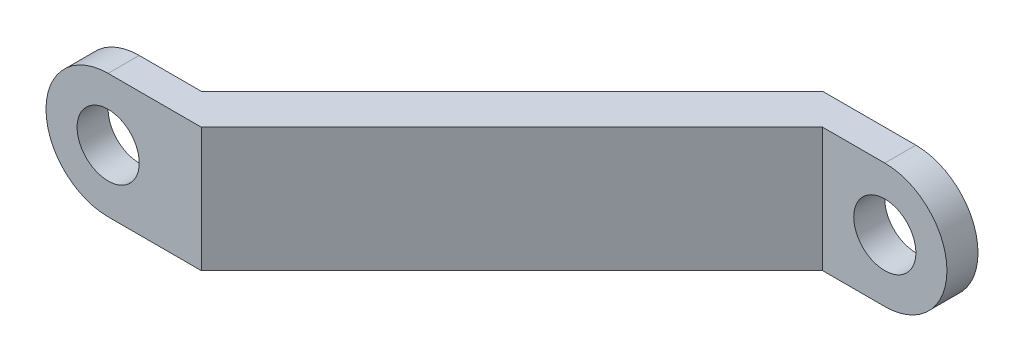
ISO-10303-21;
HEADER;
FILE_DESCRIPTION(('STEP AP214'),'2;1');
FILE_NAME('part.step','',(''),(''),'','','');
FILE_SCHEMA(('AUTOMOTIVE_DESIGN { 1 0 10303 214 1 1 1 1 }'));
ENDSEC;
DATA;
#1=APPLICATION_CONTEXT('core data for automotive mechanical design processes');
#2=APPLICATION_PROTOCOL_DEFINITION('international standard','automotive_design',2000,#1);
#3=PRODUCT_CONTEXT('',#1,'mechanical');
#4=PRODUCT('Part','Part','',(#3));
#5=PRODUCT_RELATED_PRODUCT_CATEGORY('part','',(#4));
#6=PRODUCT_DEFINITION_FORMATION('','',#4);
#7=PRODUCT_DEFINITION_CONTEXT('part definition',#1,'design');
#8=PRODUCT_DEFINITION('design','',#6,#7);
#9=PRODUCT_DEFINITION_SHAPE('','',#8);
#10=(LENGTH_UNIT() NAMED_UNIT(*) SI_UNIT(.MILLI.,.METRE.));
#11=(NAMED_UNIT(*) PLANE_ANGLE_UNIT() SI_UNIT($,.RADIAN.));
#12=(NAMED_UNIT(*) SI_UNIT($,.STERADIAN.) SOLID_ANGLE_UNIT());
#13=UNCERTAINTY_MEASURE_WITH_UNIT(LENGTH_MEASURE(1.E-05),#10,'distance_accuracy_value','');
#14=(GEOMETRIC_REPRESENTATION_CONTEXT(3) GLOBAL_UNCERTAINTY_ASSIGNED_CONTEXT((#13)) GLOBAL_UNIT_ASSIGNED_CONTEXT((#10,
#11,#12)) REPRESENTATION_CONTEXT('',''));
#15=CARTESIAN_POINT('',(0.,0.,0.));
#16=DIRECTION('',(0.,0.,1.));
#17=DIRECTION('',(1.,0.,0.));
#18=AXIS2_PLACEMENT_3D('',#15,#16,#17);
#19=CARTESIAN_POINT('',(3.9883880996466,4.,2.));
#20=DIRECTION('',(0.,0.,1.));
#21=DIRECTION('',(1.,0.,0.));
#22=AXIS2_PLACEMENT_3D('',#19,#20,#21);
#23=PLANE('',#22);
#24=CARTESIAN_POINT('',(3.9883880996466,4.,2.));
#25=DIRECTION('',(0.,0.,1.));
#26=DIRECTION('',(1.,0.,0.));
#27=AXIS2_PLACEMENT_3D('',#24,#25,#26);
#28=CIRCLE('',#27,4.);
#29=CARTESIAN_POINT('',(3.9883880996466,8.,2.));
#30=VERTEX_POINT('',#29);
#31=CARTESIAN_POINT('',(3.9883880996466,0.,2.));
#32=VERTEX_POINT('',#31);
#33=EDGE_CURVE('E205',#30,#32,#28,.T.);
#34=ORIENTED_EDGE('',*,*,#33,.T.);
#35=DIRECTION('',(1.,0.,0.));
#36=VECTOR('',#35,1.);
#37=CARTESIAN_POINT('',(3.9883880996466,0.,2.));
#38=LINE('',#37,#36);
#39=CARTESIAN_POINT('',(9.9883880996466,0.,2.));
#40=VERTEX_POINT('',#39);
#41=EDGE_CURVE('E208',#32,#40,#38,.T.);
#42=ORIENTED_EDGE('',*,*,#41,.T.);
#43=DIRECTION('',(0.,1.,0.));
#44=VECTOR('',#43,1.);
#45=CARTESIAN_POINT('',(9.9883880996466,0.,2.));
#46=LINE('',#45,#44);
#47=CARTESIAN_POINT('',(9.9883880996466,8.,2.));
#48=VERTEX_POINT('',#47);
#49=EDGE_CURVE('E213',#40,#48,#46,.T.);
#50=ORIENTED_EDGE('',*,*,#49,.T.);
#51=DIRECTION('',(-1.,0.,0.));
#52=VECTOR('',#51,1.);
#53=CARTESIAN_POINT('',(9.9883880996466,8.,2.));
#54=LINE('',#53,#52);
#55=EDGE_CURVE('E63',#48,#30,#54,.T.);
#56=ORIENTED_EDGE('',*,*,#55,.T.);
#57=EDGE_LOOP('',(#34,#42,#50,#56));
#58=FACE_BOUND('',#57,.T.);
#59=CARTESIAN_POINT('',(3.9883880996466,4.,2.));
#60=DIRECTION('',(0.,0.,1.));
#61=DIRECTION('',(1.,0.,0.));
#62=AXIS2_PLACEMENT_3D('',#59,#60,#61);
#63=CIRCLE('',#62,2.);
#64=CARTESIAN_POINT('',(5.9883880996466,4.,2.));
#65=VERTEX_POINT('',#64);
#66=EDGE_CURVE('E197',#65,#65,#63,.T.);
#67=ORIENTED_EDGE('',*,*,#66,.F.);
#68=EDGE_LOOP('',(#67));
#69=FACE_BOUND('',#68,.T.);
#70=ADVANCED_FACE('F45',(#58,#69),#23,.T.);
#71=CARTESIAN_POINT('',(3.9883880996466,4.,0.));
#72=DIRECTION('',(0.,0.,1.));
#73=DIRECTION('',(1.,0.,0.));
#74=AXIS2_PLACEMENT_3D('',#71,#72,#73);
#75=PLANE('',#74);
#76=DIRECTION('',(-1.,0.,0.));
#77=VECTOR('',#76,1.);
#78=CARTESIAN_POINT('',(9.9883880996466,8.,0.));
#79=LINE('',#78,#77);
#80=CARTESIAN_POINT('',(7.9883880996466,8.,0.));
#81=VERTEX_POINT('',#80);
#82=CARTESIAN_POINT('',(3.9883880996466,8.,0.));
#83=VERTEX_POINT('',#82);
#84=EDGE_CURVE('E209',#81,#83,#79,.T.);
#85=ORIENTED_EDGE('',*,*,#84,.F.);
#86=DIRECTION('',(0.,-1.,0.));
#87=VECTOR('',#86,1.);
#88=CARTESIAN_POINT('',(7.98838809964659,8.,0.));
#89=LINE('',#88,#87);
#90=CARTESIAN_POINT('',(7.9883880996466,0.,0.));
#91=VERTEX_POINT('',#90);
#92=EDGE_CURVE('E193',#81,#91,#89,.T.);
#93=ORIENTED_EDGE('',*,*,#92,.T.);
#94=DIRECTION('',(1.,0.,0.));
#95=VECTOR('',#94,1.);
#96=CARTESIAN_POINT('',(3.9883880996466,0.,0.));
#97=LINE('',#96,#95);
#98=CARTESIAN_POINT('',(3.9883880996466,0.,0.));
#99=VERTEX_POINT('',#98);
#100=EDGE_CURVE('E75',#99,#91,#97,.T.);
#101=ORIENTED_EDGE('',*,*,#100,.F.);
#102=CARTESIAN_POINT('',(3.9883880996466,4.,0.));
#103=DIRECTION('',(0.,0.,1.));
#104=DIRECTION('',(1.,0.,0.));
#105=AXIS2_PLACEMENT_3D('',#102,#103,#104);
#106=CIRCLE('',#105,4.);
#107=EDGE_CURVE('E201',#83,#99,#106,.T.);
#108=ORIENTED_EDGE('',*,*,#107,.F.);
#109=EDGE_LOOP('',(#85,#93,#101,#108));
#110=FACE_BOUND('',#109,.T.);
#111=CARTESIAN_POINT('',(3.9883880996466,4.,0.));
#112=DIRECTION('',(0.,0.,1.));
#113=DIRECTION('',(1.,0.,0.));
#114=AXIS2_PLACEMENT_3D('',#111,#112,#113);
#115=CIRCLE('',#114,2.);
#116=CARTESIAN_POINT('',(5.9883880996466,4.,0.));
#117=VERTEX_POINT('',#116);
#118=EDGE_CURVE('E196',#117,#117,#115,.T.);
#119=ORIENTED_EDGE('',*,*,#118,.T.);
#120=EDGE_LOOP('',(#119));
#121=FACE_BOUND('',#120,.T.);
#122=ADVANCED_FACE('F230',(#110,#121),#75,.F.);
#123=CARTESIAN_POINT('',(3.9883880996466,4.,2.));
#124=DIRECTION('',(0.,0.,-1.));
#125=DIRECTION('',(-1.,0.,0.));
#126=AXIS2_PLACEMENT_3D('',#123,#124,#125);
#127=CYLINDRICAL_SURFACE('',#126,4.);
#128=ORIENTED_EDGE('',*,*,#107,.T.);
#129=DIRECTION('',(0.,0.,-1.));
#130=VECTOR('',#129,1.);
#131=CARTESIAN_POINT('',(3.9883880996466,0.,2.));
#132=LINE('',#131,#130);
#133=EDGE_CURVE('E11',#32,#99,#132,.T.);
#134=ORIENTED_EDGE('',*,*,#133,.F.);
#135=ORIENTED_EDGE('',*,*,#33,.F.);
#136=DIRECTION('',(0.,0.,-1.));
#137=VECTOR('',#136,1.);
#138=CARTESIAN_POINT('',(3.9883880996466,8.,2.));
#139=LINE('',#138,#137);
#140=EDGE_CURVE('E55',#30,#83,#139,.T.);
#141=ORIENTED_EDGE('',*,*,#140,.T.);
#142=EDGE_LOOP('',(#128,#134,#135,#141));
#143=FACE_BOUND('',#142,.T.);
#144=ADVANCED_FACE('F47',(#143),#127,.T.);
#145=CARTESIAN_POINT('',(3.9883880996466,0.,2.));
#146=DIRECTION('',(0.,1.,0.));
#147=DIRECTION('',(-1.,0.,0.));
#148=AXIS2_PLACEMENT_3D('',#145,#146,#147);
#149=PLANE('',#148);
#150=DIRECTION('',(-1.,0.,0.));
#151=VECTOR('',#150,1.);
#152=CARTESIAN_POINT('',(27.9853678716021,0.,-17.9984898859778));
#153=LINE('',#152,#151);
#154=CARTESIAN_POINT('',(33.9853678716021,0.,-17.9984898859778));
#155=VERTEX_POINT('',#154);
#156=CARTESIAN_POINT('',(29.9868779856243,0.,-17.9984898859778));
#157=VERTEX_POINT('',#156);
#158=EDGE_CURVE('E149',#155,#157,#153,.T.);
#159=ORIENTED_EDGE('',*,*,#158,.T.);
#160=DIRECTION('',(-0.707106781186546,0.,0.707106781186549));
#161=VECTOR('',#160,1.);
#162=CARTESIAN_POINT('',(29.9853678716021,0.,-17.9969797719556));
#163=LINE('',#162,#161);
#164=EDGE_CURVE('E133',#157,#40,#163,.T.);
#165=ORIENTED_EDGE('',*,*,#164,.T.);
#166=ORIENTED_EDGE('',*,*,#41,.F.);
#167=ORIENTED_EDGE('',*,*,#133,.T.);
#168=ORIENTED_EDGE('',*,*,#100,.T.);
#169=DIRECTION('',(-0.707106781186546,0.,0.707106781186549));
#170=VECTOR('',#169,1.);
#171=CARTESIAN_POINT('',(27.9853678716021,0.,-19.9969797719556));
#172=LINE('',#171,#170);
#173=CARTESIAN_POINT('',(27.9853678716021,0.,-19.9969797719556));
#174=VERTEX_POINT('',#173);
#175=EDGE_CURVE('E188',#174,#91,#172,.T.);
#176=ORIENTED_EDGE('',*,*,#175,.F.);
#177=DIRECTION('',(0.,0.,-1.));
#178=VECTOR('',#177,1.);
#179=CARTESIAN_POINT('',(27.9853678716021,0.,-17.9984898859778));
#180=LINE('',#179,#178);
#181=CARTESIAN_POINT('',(27.9853678716021,0.,-19.9984898859778));
#182=VERTEX_POINT('',#181);
#183=EDGE_CURVE('E172',#174,#182,#180,.T.);
#184=ORIENTED_EDGE('',*,*,#183,.T.);
#185=DIRECTION('',(-1.,0.,0.));
#186=VECTOR('',#185,1.);
#187=CARTESIAN_POINT('',(27.9853678716021,0.,-19.9984898859778));
#188=LINE('',#187,#186);
#189=CARTESIAN_POINT('',(33.9853678716021,0.,-19.9984898859778));
#190=VERTEX_POINT('',#189);
#191=EDGE_CURVE('E145',#190,#182,#188,.T.);
#192=ORIENTED_EDGE('',*,*,#191,.F.);
#193=DIRECTION('',(0.,0.,-1.));
#194=VECTOR('',#193,1.);
#195=CARTESIAN_POINT('',(33.9853678716021,0.,-17.9984898859778));
#196=LINE('',#195,#194);
#197=EDGE_CURVE('E175',#155,#190,#196,.T.);
#198=ORIENTED_EDGE('',*,*,#197,.F.);
#199=EDGE_LOOP('',(#159,#165,#166,#167,#168,#176,#184,#192,#198));
#200=FACE_BOUND('',#199,.T.);
#201=ADVANCED_FACE('F240',(#200),#149,.F.);
#202=CARTESIAN_POINT('',(9.9883880996466,8.,2.));
#203=DIRECTION('',(0.,-1.,0.));
#204=DIRECTION('',(0.,0.,-1.));
#205=AXIS2_PLACEMENT_3D('',#202,#203,#204);
#206=PLANE('',#205);
#207=DIRECTION('',(-0.707106781186546,0.,0.707106781186549));
#208=VECTOR('',#207,1.);
#209=CARTESIAN_POINT('',(29.9853678716021,8.00000000000001,-17.9969797719556));
#210=LINE('',#209,#208);
#211=CARTESIAN_POINT('',(29.9868779856243,8.,-17.9984898859778));
#212=VERTEX_POINT('',#211);
#213=EDGE_CURVE('E83',#212,#48,#210,.T.);
#214=ORIENTED_EDGE('',*,*,#213,.F.);
#215=DIRECTION('',(1.,0.,0.));
#216=VECTOR('',#215,1.);
#217=CARTESIAN_POINT('',(27.9853678716021,8.,-17.9984898859778));
#218=LINE('',#217,#216);
#219=CARTESIAN_POINT('',(33.9853678716021,8.,-17.9984898859778));
#220=VERTEX_POINT('',#219);
#221=EDGE_CURVE('E124',#212,#220,#218,.T.);
#222=ORIENTED_EDGE('',*,*,#221,.T.);
#223=DIRECTION('',(0.,0.,-1.));
#224=VECTOR('',#223,1.);
#225=CARTESIAN_POINT('',(33.9853678716021,8.,-17.9984898859778));
#226=LINE('',#225,#224);
#227=CARTESIAN_POINT('',(33.9853678716021,8.,-19.9984898859778));
#228=VERTEX_POINT('',#227);
#229=EDGE_CURVE('E178',#220,#228,#226,.T.);
#230=ORIENTED_EDGE('',*,*,#229,.T.);
#231=DIRECTION('',(1.,0.,0.));
#232=VECTOR('',#231,1.);
#233=CARTESIAN_POINT('',(27.9853678716021,8.,-19.9984898859778));
#234=LINE('',#233,#232);
#235=CARTESIAN_POINT('',(27.9853678716021,8.,-19.9984898859778));
#236=VERTEX_POINT('',#235);
#237=EDGE_CURVE('E164',#236,#228,#234,.T.);
#238=ORIENTED_EDGE('',*,*,#237,.F.);
#239=DIRECTION('',(0.,0.,-1.));
#240=VECTOR('',#239,1.);
#241=CARTESIAN_POINT('',(27.9853678716021,8.,-17.9984898859778));
#242=LINE('',#241,#240);
#243=CARTESIAN_POINT('',(27.9853678716021,8.,-19.9969797719556));
#244=VERTEX_POINT('',#243);
#245=EDGE_CURVE('E159',#244,#236,#242,.T.);
#246=ORIENTED_EDGE('',*,*,#245,.F.);
#247=DIRECTION('',(-0.707106781186546,0.,0.707106781186549));
#248=VECTOR('',#247,1.);
#249=CARTESIAN_POINT('',(27.9853678716021,8.00000000000001,-19.9969797719556));
#250=LINE('',#249,#248);
#251=EDGE_CURVE('E127',#244,#81,#250,.T.);
#252=ORIENTED_EDGE('',*,*,#251,.T.);
#253=ORIENTED_EDGE('',*,*,#84,.T.);
#254=ORIENTED_EDGE('',*,*,#140,.F.);
#255=ORIENTED_EDGE('',*,*,#55,.F.);
#256=EDGE_LOOP('',(#214,#222,#230,#238,#246,#252,#253,#254,#255));
#257=FACE_BOUND('',#256,.T.);
#258=ADVANCED_FACE('F122',(#257),#206,.F.);
#259=CARTESIAN_POINT('',(3.9883880996466,4.,2.));
#260=DIRECTION('',(0.,0.,-1.));
#261=DIRECTION('',(-1.,0.,0.));
#262=AXIS2_PLACEMENT_3D('',#259,#260,#261);
#263=CYLINDRICAL_SURFACE('',#262,2.);
#264=ORIENTED_EDGE('',*,*,#66,.T.);
#265=EDGE_LOOP('',(#264));
#266=FACE_BOUND('',#265,.T.);
#267=ORIENTED_EDGE('',*,*,#118,.F.);
#268=EDGE_LOOP('',(#267));
#269=FACE_BOUND('',#268,.T.);
#270=ADVANCED_FACE('F248',(#266,#269),#263,.F.);
#271=CARTESIAN_POINT('',(29.9853678716021,8.00000000000001,-17.9969797719556));
#272=DIRECTION('',(-0.707106781186549,0.,-0.707106781186546));
#273=DIRECTION('',(-0.707106781186546,0.,0.707106781186549));
#274=AXIS2_PLACEMENT_3D('',#271,#272,#273);
#275=PLANE('',#274);
#276=ORIENTED_EDGE('',*,*,#164,.F.);
#277=DIRECTION('',(0.,1.,0.));
#278=VECTOR('',#277,1.);
#279=CARTESIAN_POINT('',(29.9868779856243,-2.83056274847711,-17.9984898859778));
#280=LINE('',#279,#278);
#281=EDGE_CURVE('E131',#157,#212,#280,.T.);
#282=ORIENTED_EDGE('',*,*,#281,.T.);
#283=ORIENTED_EDGE('',*,*,#213,.T.);
#284=ORIENTED_EDGE('',*,*,#49,.F.);
#285=EDGE_LOOP('',(#276,#282,#283,#284));
#286=FACE_BOUND('',#285,.T.);
#287=ADVANCED_FACE('F132',(#286),#275,.F.);
#288=CARTESIAN_POINT('',(27.9853678716021,8.00000000000001,-19.9969797719556));
#289=DIRECTION('',(0.707106781186549,0.,0.707106781186546));
#290=DIRECTION('',(0.707106781186546,0.,-0.707106781186549));
#291=AXIS2_PLACEMENT_3D('',#288,#289,#290);
#292=PLANE('',#291);
#293=ORIENTED_EDGE('',*,*,#92,.F.);
#294=ORIENTED_EDGE('',*,*,#251,.F.);
#295=DIRECTION('',(0.,1.,0.));
#296=VECTOR('',#295,1.);
#297=CARTESIAN_POINT('',(27.9853678716021,8.00000000000001,-19.9969797719556));
#298=LINE('',#297,#296);
#299=EDGE_CURVE('E128',#174,#244,#298,.T.);
#300=ORIENTED_EDGE('',*,*,#299,.F.);
#301=ORIENTED_EDGE('',*,*,#175,.T.);
#302=EDGE_LOOP('',(#293,#294,#300,#301));
#303=FACE_BOUND('',#302,.T.);
#304=ADVANCED_FACE('F237',(#303),#292,.F.);
#305=CARTESIAN_POINT('',(27.9853678716021,8.,-17.9984898859778));
#306=DIRECTION('',(-1.,0.,0.));
#307=DIRECTION('',(0.,0.,1.));
#308=AXIS2_PLACEMENT_3D('',#305,#306,#307);
#309=PLANE('',#308);
#310=ORIENTED_EDGE('',*,*,#183,.F.);
#311=ORIENTED_EDGE('',*,*,#299,.T.);
#312=ORIENTED_EDGE('',*,*,#245,.T.);
#313=DIRECTION('',(0.,1.,0.));
#314=VECTOR('',#313,1.);
#315=CARTESIAN_POINT('',(27.9853678716021,8.,-19.9984898859778));
#316=LINE('',#315,#314);
#317=EDGE_CURVE('E160',#182,#236,#316,.T.);
#318=ORIENTED_EDGE('',*,*,#317,.F.);
#319=EDGE_LOOP('',(#310,#311,#312,#318));
#320=FACE_BOUND('',#319,.T.);
#321=ADVANCED_FACE('F319',(#320),#309,.T.);
#322=CARTESIAN_POINT('',(33.9853678716021,4.,-17.9984898859778));
#323=DIRECTION('',(0.,0.,-1.));
#324=DIRECTION('',(-1.,0.,0.));
#325=AXIS2_PLACEMENT_3D('',#322,#323,#324);
#326=CYLINDRICAL_SURFACE('',#325,4.);
#327=CARTESIAN_POINT('',(33.9853678716021,4.,-19.9984898859778));
#328=DIRECTION('',(0.,0.,-1.));
#329=DIRECTION('',(-1.,0.,0.));
#330=AXIS2_PLACEMENT_3D('',#327,#328,#329);
#331=CIRCLE('',#330,4.);
#332=EDGE_CURVE('E152',#228,#190,#331,.T.);
#333=ORIENTED_EDGE('',*,*,#332,.F.);
#334=ORIENTED_EDGE('',*,*,#229,.F.);
#335=CARTESIAN_POINT('',(33.9853678716021,4.,-17.9984898859778));
#336=DIRECTION('',(0.,0.,-1.));
#337=DIRECTION('',(-1.,0.,0.));
#338=AXIS2_PLACEMENT_3D('',#335,#336,#337);
#339=CIRCLE('',#338,4.);
#340=EDGE_CURVE('E143',#220,#155,#339,.T.);
#341=ORIENTED_EDGE('',*,*,#340,.T.);
#342=ORIENTED_EDGE('',*,*,#197,.T.);
#343=EDGE_LOOP('',(#333,#334,#341,#342));
#344=FACE_BOUND('',#343,.T.);
#345=ADVANCED_FACE('F288',(#344),#326,.T.);
#346=CARTESIAN_POINT('',(33.9853678716021,4.,-17.9984898859778));
#347=DIRECTION('',(0.,0.,-1.));
#348=DIRECTION('',(-1.,0.,0.));
#349=AXIS2_PLACEMENT_3D('',#346,#347,#348);
#350=PLANE('',#349);
#351=CARTESIAN_POINT('',(33.9853678716021,4.,-17.9984898859778));
#352=DIRECTION('',(0.,0.,-1.));
#353=DIRECTION('',(-1.,0.,0.));
#354=AXIS2_PLACEMENT_3D('',#351,#352,#353);
#355=CIRCLE('',#354,2.);
#356=CARTESIAN_POINT('',(31.9853678716021,4.,-17.9984898859778));
#357=VERTEX_POINT('',#356);
#358=EDGE_CURVE('E165',#357,#357,#355,.T.);
#359=ORIENTED_EDGE('',*,*,#358,.T.);
#360=EDGE_LOOP('',(#359));
#361=FACE_BOUND('',#360,.T.);
#362=ORIENTED_EDGE('',*,*,#221,.F.);
#363=ORIENTED_EDGE('',*,*,#281,.F.);
#364=ORIENTED_EDGE('',*,*,#158,.F.);
#365=ORIENTED_EDGE('',*,*,#340,.F.);
#366=EDGE_LOOP('',(#362,#363,#364,#365));
#367=FACE_BOUND('',#366,.T.);
#368=ADVANCED_FACE('F141',(#361,#367),#350,.F.);
#369=CARTESIAN_POINT('',(33.9853678716021,4.,-19.9984898859778));
#370=DIRECTION('',(0.,0.,-1.));
#371=DIRECTION('',(-1.,0.,0.));
#372=AXIS2_PLACEMENT_3D('',#369,#370,#371);
#373=PLANE('',#372);
#374=CARTESIAN_POINT('',(33.9853678716021,4.,-19.9984898859778));
#375=DIRECTION('',(0.,0.,-1.));
#376=DIRECTION('',(-1.,0.,0.));
#377=AXIS2_PLACEMENT_3D('',#374,#375,#376);
#378=CIRCLE('',#377,2.);
#379=CARTESIAN_POINT('',(31.9853678716021,4.,-19.9984898859778));
#380=VERTEX_POINT('',#379);
#381=EDGE_CURVE('E138',#380,#380,#378,.T.);
#382=ORIENTED_EDGE('',*,*,#381,.F.);
#383=EDGE_LOOP('',(#382));
#384=FACE_BOUND('',#383,.T.);
#385=ORIENTED_EDGE('',*,*,#317,.T.);
#386=ORIENTED_EDGE('',*,*,#237,.T.);
#387=ORIENTED_EDGE('',*,*,#332,.T.);
#388=ORIENTED_EDGE('',*,*,#191,.T.);
#389=EDGE_LOOP('',(#385,#386,#387,#388));
#390=FACE_BOUND('',#389,.T.);
#391=ADVANCED_FACE('F287',(#384,#390),#373,.T.);
#392=CARTESIAN_POINT('',(33.9853678716021,4.,-17.9984898859778));
#393=DIRECTION('',(0.,0.,-1.));
#394=DIRECTION('',(-1.,0.,0.));
#395=AXIS2_PLACEMENT_3D('',#392,#393,#394);
#396=CYLINDRICAL_SURFACE('',#395,2.);
#397=ORIENTED_EDGE('',*,*,#358,.F.);
#398=EDGE_LOOP('',(#397));
#399=FACE_BOUND('',#398,.T.);
#400=ORIENTED_EDGE('',*,*,#381,.T.);
#401=EDGE_LOOP('',(#400));
#402=FACE_BOUND('',#401,.T.);
#403=ADVANCED_FACE('F270',(#399,#402),#396,.F.);
#404=CLOSED_SHELL('',(#70,#122,#144,#201,#258,#270,#287,#304,#321,#345,#368,#391,#403));
#405=MANIFOLD_SOLID_BREP('B2',#404);
#406=ADVANCED_BREP_SHAPE_REPRESENTATION('',(#18,#405),#14);
#407=SHAPE_DEFINITION_REPRESENTATION(#9,#406);
ENDSEC;
END-ISO-10303-21;
